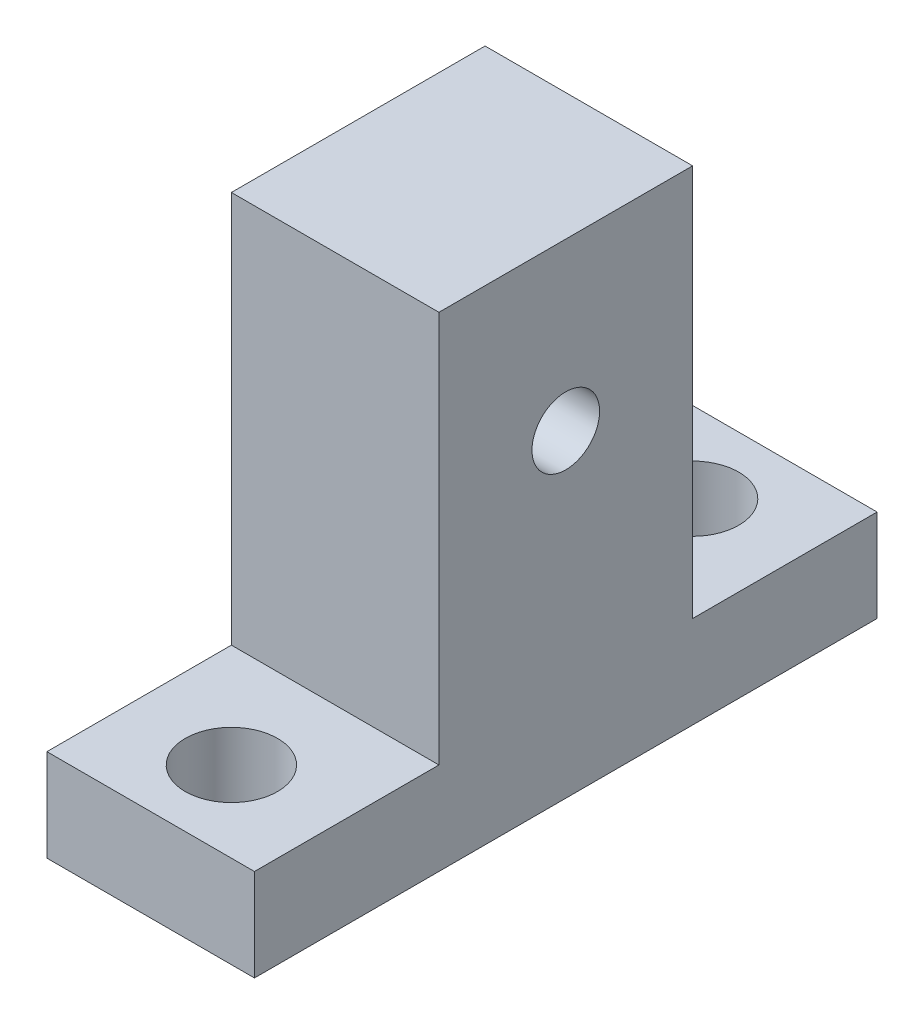
ISO-10303-21;
HEADER;
FILE_DESCRIPTION(('STEP AP214'),'2;1');
FILE_NAME('part.step','',(''),(''),'','','');
FILE_SCHEMA(('AUTOMOTIVE_DESIGN { 1 0 10303 214 1 1 1 1 }'));
ENDSEC;
DATA;
#1=APPLICATION_CONTEXT('core data for automotive mechanical design processes');
#2=APPLICATION_PROTOCOL_DEFINITION('international standard','automotive_design',2000,#1);
#3=PRODUCT_CONTEXT('',#1,'mechanical');
#4=PRODUCT('Part','Part','',(#3));
#5=PRODUCT_RELATED_PRODUCT_CATEGORY('part','',(#4));
#6=PRODUCT_DEFINITION_FORMATION('','',#4);
#7=PRODUCT_DEFINITION_CONTEXT('part definition',#1,'design');
#8=PRODUCT_DEFINITION('design','',#6,#7);
#9=PRODUCT_DEFINITION_SHAPE('','',#8);
#10=(LENGTH_UNIT() NAMED_UNIT(*) SI_UNIT(.MILLI.,.METRE.));
#11=(NAMED_UNIT(*) PLANE_ANGLE_UNIT() SI_UNIT($,.RADIAN.));
#12=(NAMED_UNIT(*) SI_UNIT($,.STERADIAN.) SOLID_ANGLE_UNIT());
#13=UNCERTAINTY_MEASURE_WITH_UNIT(LENGTH_MEASURE(1.E-05),#10,'distance_accuracy_value','');
#14=(GEOMETRIC_REPRESENTATION_CONTEXT(3) GLOBAL_UNCERTAINTY_ASSIGNED_CONTEXT((#13)) GLOBAL_UNIT_ASSIGNED_CONTEXT((#10,
#11,#12)) REPRESENTATION_CONTEXT('',''));
#15=CARTESIAN_POINT('',(0.,0.,0.));
#16=DIRECTION('',(0.,0.,1.));
#17=DIRECTION('',(1.,0.,0.));
#18=AXIS2_PLACEMENT_3D('',#15,#16,#17);
#19=CARTESIAN_POINT('',(14.2875,0.,0.));
#20=DIRECTION('',(1.,0.,0.));
#21=DIRECTION('',(0.,0.,-1.));
#22=AXIS2_PLACEMENT_3D('',#19,#20,#21);
#23=PLANE('',#22);
#24=DIRECTION('',(0.,-1.,0.));
#25=VECTOR('',#24,1.);
#26=CARTESIAN_POINT('',(14.2875,6.34999999999998,0.));
#27=LINE('',#26,#25);
#28=CARTESIAN_POINT('',(14.2875,6.34999999999998,0.));
#29=VERTEX_POINT('',#28);
#30=CARTESIAN_POINT('',(14.2875,0.,0.));
#31=VERTEX_POINT('',#30);
#32=EDGE_CURVE('E163',#29,#31,#27,.T.);
#33=ORIENTED_EDGE('',*,*,#32,.T.);
#34=DIRECTION('',(0.,0.,-1.));
#35=VECTOR('',#34,1.);
#36=CARTESIAN_POINT('',(14.2875,0.,0.));
#37=LINE('',#36,#35);
#38=CARTESIAN_POINT('',(14.2875,0.,-42.8625));
#39=VERTEX_POINT('',#38);
#40=EDGE_CURVE('E99',#31,#39,#37,.T.);
#41=ORIENTED_EDGE('',*,*,#40,.T.);
#42=DIRECTION('',(0.,1.,0.));
#43=VECTOR('',#42,1.);
#44=CARTESIAN_POINT('',(14.2875,0.,-42.8625));
#45=LINE('',#44,#43);
#46=CARTESIAN_POINT('',(14.2875,6.34999999999999,-42.8625));
#47=VERTEX_POINT('',#46);
#48=EDGE_CURVE('E184',#39,#47,#45,.T.);
#49=ORIENTED_EDGE('',*,*,#48,.T.);
#50=DIRECTION('',(0.,0.,1.));
#51=VECTOR('',#50,1.);
#52=CARTESIAN_POINT('',(14.2875,6.34999999999999,-42.8625));
#53=LINE('',#52,#51);
#54=CARTESIAN_POINT('',(14.2875,6.34999999999998,-30.1625));
#55=VERTEX_POINT('',#54);
#56=EDGE_CURVE('E198',#47,#55,#53,.T.);
#57=ORIENTED_EDGE('',*,*,#56,.T.);
#58=DIRECTION('',(0.,1.,0.));
#59=VECTOR('',#58,1.);
#60=CARTESIAN_POINT('',(14.2875,6.34999999999998,-30.1625));
#61=LINE('',#60,#59);
#62=CARTESIAN_POINT('',(14.2875,33.3375,-30.1625));
#63=VERTEX_POINT('',#62);
#64=EDGE_CURVE('E118',#55,#63,#61,.T.);
#65=ORIENTED_EDGE('',*,*,#64,.T.);
#66=DIRECTION('',(0.,0.,1.));
#67=VECTOR('',#66,1.);
#68=CARTESIAN_POINT('',(14.2875,33.3375,-30.1625));
#69=LINE('',#68,#67);
#70=CARTESIAN_POINT('',(14.2875,33.3375,-12.7));
#71=VERTEX_POINT('',#70);
#72=EDGE_CURVE('E112',#63,#71,#69,.T.);
#73=ORIENTED_EDGE('',*,*,#72,.T.);
#74=DIRECTION('',(0.,-1.,0.));
#75=VECTOR('',#74,1.);
#76=CARTESIAN_POINT('',(14.2875,33.3375,-12.7));
#77=LINE('',#76,#75);
#78=CARTESIAN_POINT('',(14.2875,6.34999999999999,-12.7));
#79=VERTEX_POINT('',#78);
#80=EDGE_CURVE('E116',#71,#79,#77,.T.);
#81=ORIENTED_EDGE('',*,*,#80,.T.);
#82=DIRECTION('',(0.,0.,1.));
#83=VECTOR('',#82,1.);
#84=CARTESIAN_POINT('',(14.2875,6.34999999999999,-12.7));
#85=LINE('',#84,#83);
#86=EDGE_CURVE('E56',#79,#29,#85,.T.);
#87=ORIENTED_EDGE('',*,*,#86,.T.);
#88=EDGE_LOOP('',(#33,#41,#49,#57,#65,#73,#81,#87));
#89=FACE_BOUND('',#88,.T.);
#90=CARTESIAN_POINT('',(14.2875,21.9075,-21.43125));
#91=DIRECTION('',(1.,0.,0.));
#92=DIRECTION('',(0.,0.,-1.));
#93=AXIS2_PLACEMENT_3D('',#90,#91,#92);
#94=CIRCLE('',#93,2.32833333333333);
#95=CARTESIAN_POINT('',(14.2875,21.9075,-23.7595833333333));
#96=VERTEX_POINT('',#95);
#97=EDGE_CURVE('E145',#96,#96,#94,.T.);
#98=ORIENTED_EDGE('',*,*,#97,.F.);
#99=EDGE_LOOP('',(#98));
#100=FACE_BOUND('',#99,.T.);
#101=ADVANCED_FACE('F38',(#89,#100),#23,.T.);
#102=CARTESIAN_POINT('',(0.,0.,0.));
#103=DIRECTION('',(1.,0.,0.));
#104=DIRECTION('',(0.,0.,-1.));
#105=AXIS2_PLACEMENT_3D('',#102,#103,#104);
#106=PLANE('',#105);
#107=DIRECTION('',(0.,-1.,0.));
#108=VECTOR('',#107,1.);
#109=CARTESIAN_POINT('',(0.,6.34999999999998,0.));
#110=LINE('',#109,#108);
#111=CARTESIAN_POINT('',(0.,6.34999999999998,0.));
#112=VERTEX_POINT('',#111);
#113=CARTESIAN_POINT('',(0.,0.,0.));
#114=VERTEX_POINT('',#113);
#115=EDGE_CURVE('E140',#112,#114,#110,.T.);
#116=ORIENTED_EDGE('',*,*,#115,.F.);
#117=DIRECTION('',(0.,0.,1.));
#118=VECTOR('',#117,1.);
#119=CARTESIAN_POINT('',(0.,6.34999999999999,-12.7));
#120=LINE('',#119,#118);
#121=CARTESIAN_POINT('',(0.,6.34999999999999,-12.7));
#122=VERTEX_POINT('',#121);
#123=EDGE_CURVE('E91',#122,#112,#120,.T.);
#124=ORIENTED_EDGE('',*,*,#123,.F.);
#125=DIRECTION('',(0.,-1.,0.));
#126=VECTOR('',#125,1.);
#127=CARTESIAN_POINT('',(0.,33.3375,-12.7));
#128=LINE('',#127,#126);
#129=CARTESIAN_POINT('',(0.,33.3375,-12.7));
#130=VERTEX_POINT('',#129);
#131=EDGE_CURVE('E85',#130,#122,#128,.T.);
#132=ORIENTED_EDGE('',*,*,#131,.F.);
#133=DIRECTION('',(0.,0.,1.));
#134=VECTOR('',#133,1.);
#135=CARTESIAN_POINT('',(0.,33.3375,-30.1625));
#136=LINE('',#135,#134);
#137=CARTESIAN_POINT('',(0.,33.3375,-30.1625));
#138=VERTEX_POINT('',#137);
#139=EDGE_CURVE('E127',#138,#130,#136,.T.);
#140=ORIENTED_EDGE('',*,*,#139,.F.);
#141=DIRECTION('',(0.,1.,0.));
#142=VECTOR('',#141,1.);
#143=CARTESIAN_POINT('',(0.,6.34999999999998,-30.1625));
#144=LINE('',#143,#142);
#145=CARTESIAN_POINT('',(0.,6.34999999999998,-30.1625));
#146=VERTEX_POINT('',#145);
#147=EDGE_CURVE('E154',#146,#138,#144,.T.);
#148=ORIENTED_EDGE('',*,*,#147,.F.);
#149=DIRECTION('',(0.,0.,1.));
#150=VECTOR('',#149,1.);
#151=CARTESIAN_POINT('',(0.,6.34999999999999,-42.8625));
#152=LINE('',#151,#150);
#153=CARTESIAN_POINT('',(0.,6.34999999999999,-42.8625));
#154=VERTEX_POINT('',#153);
#155=EDGE_CURVE('E151',#154,#146,#152,.T.);
#156=ORIENTED_EDGE('',*,*,#155,.F.);
#157=DIRECTION('',(0.,1.,0.));
#158=VECTOR('',#157,1.);
#159=CARTESIAN_POINT('',(0.,0.,-42.8625));
#160=LINE('',#159,#158);
#161=CARTESIAN_POINT('',(0.,0.,-42.8625));
#162=VERTEX_POINT('',#161);
#163=EDGE_CURVE('E148',#162,#154,#160,.T.);
#164=ORIENTED_EDGE('',*,*,#163,.F.);
#165=DIRECTION('',(0.,0.,-1.));
#166=VECTOR('',#165,1.);
#167=CARTESIAN_POINT('',(0.,0.,0.));
#168=LINE('',#167,#166);
#169=EDGE_CURVE('E144',#114,#162,#168,.T.);
#170=ORIENTED_EDGE('',*,*,#169,.F.);
#171=EDGE_LOOP('',(#116,#124,#132,#140,#148,#156,#164,#170));
#172=FACE_BOUND('',#171,.T.);
#173=CARTESIAN_POINT('',(0.,21.9075,-21.43125));
#174=DIRECTION('',(1.,0.,0.));
#175=DIRECTION('',(0.,0.,-1.));
#176=AXIS2_PLACEMENT_3D('',#173,#174,#175);
#177=CIRCLE('',#176,2.32833333333333);
#178=CARTESIAN_POINT('',(0.,21.9075,-23.7595833333333));
#179=VERTEX_POINT('',#178);
#180=EDGE_CURVE('E208',#179,#179,#177,.T.);
#181=ORIENTED_EDGE('',*,*,#180,.T.);
#182=EDGE_LOOP('',(#181));
#183=FACE_BOUND('',#182,.T.);
#184=ADVANCED_FACE('F188',(#172,#183),#106,.F.);
#185=CARTESIAN_POINT('',(14.2875,6.34999999999998,0.));
#186=DIRECTION('',(0.,0.,-1.));
#187=DIRECTION('',(0.,1.,0.));
#188=AXIS2_PLACEMENT_3D('',#185,#186,#187);
#189=PLANE('',#188);
#190=ORIENTED_EDGE('',*,*,#115,.T.);
#191=DIRECTION('',(-1.,0.,0.));
#192=VECTOR('',#191,1.);
#193=CARTESIAN_POINT('',(14.2875,0.,0.));
#194=LINE('',#193,#192);
#195=EDGE_CURVE('E11',#31,#114,#194,.T.);
#196=ORIENTED_EDGE('',*,*,#195,.F.);
#197=ORIENTED_EDGE('',*,*,#32,.F.);
#198=DIRECTION('',(-1.,0.,0.));
#199=VECTOR('',#198,1.);
#200=CARTESIAN_POINT('',(14.2875,6.34999999999998,0.));
#201=LINE('',#200,#199);
#202=EDGE_CURVE('E136',#29,#112,#201,.T.);
#203=ORIENTED_EDGE('',*,*,#202,.T.);
#204=EDGE_LOOP('',(#190,#196,#197,#203));
#205=FACE_BOUND('',#204,.T.);
#206=ADVANCED_FACE('F40',(#205),#189,.F.);
#207=CARTESIAN_POINT('',(14.2875,0.,0.));
#208=DIRECTION('',(0.,1.,0.));
#209=DIRECTION('',(0.,0.,1.));
#210=AXIS2_PLACEMENT_3D('',#207,#208,#209);
#211=PLANE('',#210);
#212=CARTESIAN_POINT('',(7.14375,0.,-5.55625));
#213=DIRECTION('',(0.,1.,0.));
#214=DIRECTION('',(0.,0.,1.));
#215=AXIS2_PLACEMENT_3D('',#212,#213,#214);
#216=CIRCLE('',#215,3.175);
#217=CARTESIAN_POINT('',(7.14375,0.,-2.38124999999999));
#218=VERTEX_POINT('',#217);
#219=EDGE_CURVE('E219',#218,#218,#216,.T.);
#220=ORIENTED_EDGE('',*,*,#219,.T.);
#221=EDGE_LOOP('',(#220));
#222=FACE_BOUND('',#221,.T.);
#223=CARTESIAN_POINT('',(7.14375,0.,-37.30625));
#224=DIRECTION('',(0.,1.,0.));
#225=DIRECTION('',(0.,0.,1.));
#226=AXIS2_PLACEMENT_3D('',#223,#224,#225);
#227=CIRCLE('',#226,3.175);
#228=CARTESIAN_POINT('',(7.14375,0.,-34.13125));
#229=VERTEX_POINT('',#228);
#230=EDGE_CURVE('E212',#229,#229,#227,.T.);
#231=ORIENTED_EDGE('',*,*,#230,.T.);
#232=EDGE_LOOP('',(#231));
#233=FACE_BOUND('',#232,.T.);
#234=ORIENTED_EDGE('',*,*,#169,.T.);
#235=DIRECTION('',(-1.,0.,0.));
#236=VECTOR('',#235,1.);
#237=CARTESIAN_POINT('',(14.2875,0.,-42.8625));
#238=LINE('',#237,#236);
#239=EDGE_CURVE('E48',#39,#162,#238,.T.);
#240=ORIENTED_EDGE('',*,*,#239,.F.);
#241=ORIENTED_EDGE('',*,*,#40,.F.);
#242=ORIENTED_EDGE('',*,*,#195,.T.);
#243=EDGE_LOOP('',(#234,#240,#241,#242));
#244=FACE_BOUND('',#243,.T.);
#245=ADVANCED_FACE('F314',(#222,#233,#244),#211,.F.);
#246=CARTESIAN_POINT('',(14.2875,0.,-42.8625));
#247=DIRECTION('',(0.,0.,1.));
#248=DIRECTION('',(1.,0.,0.));
#249=AXIS2_PLACEMENT_3D('',#246,#247,#248);
#250=PLANE('',#249);
#251=ORIENTED_EDGE('',*,*,#163,.T.);
#252=DIRECTION('',(-1.,0.,0.));
#253=VECTOR('',#252,1.);
#254=CARTESIAN_POINT('',(14.2875,6.34999999999999,-42.8625));
#255=LINE('',#254,#253);
#256=EDGE_CURVE('E174',#47,#154,#255,.T.);
#257=ORIENTED_EDGE('',*,*,#256,.F.);
#258=ORIENTED_EDGE('',*,*,#48,.F.);
#259=ORIENTED_EDGE('',*,*,#239,.T.);
#260=EDGE_LOOP('',(#251,#257,#258,#259));
#261=FACE_BOUND('',#260,.T.);
#262=ADVANCED_FACE('F182',(#261),#250,.F.);
#263=CARTESIAN_POINT('',(14.2875,6.34999999999999,-42.8625));
#264=DIRECTION('',(0.,-1.,0.));
#265=DIRECTION('',(0.,0.,-1.));
#266=AXIS2_PLACEMENT_3D('',#263,#264,#265);
#267=PLANE('',#266);
#268=CARTESIAN_POINT('',(7.14375,6.34999999999999,-37.30625));
#269=DIRECTION('',(0.,1.,0.));
#270=DIRECTION('',(0.,0.,1.));
#271=AXIS2_PLACEMENT_3D('',#268,#269,#270);
#272=CIRCLE('',#271,3.175);
#273=CARTESIAN_POINT('',(7.14375,6.34999999999999,-34.13125));
#274=VERTEX_POINT('',#273);
#275=EDGE_CURVE('E224',#274,#274,#272,.T.);
#276=ORIENTED_EDGE('',*,*,#275,.F.);
#277=EDGE_LOOP('',(#276));
#278=FACE_BOUND('',#277,.T.);
#279=ORIENTED_EDGE('',*,*,#155,.T.);
#280=DIRECTION('',(-1.,0.,0.));
#281=VECTOR('',#280,1.);
#282=CARTESIAN_POINT('',(14.2875,6.34999999999998,-30.1625));
#283=LINE('',#282,#281);
#284=EDGE_CURVE('E170',#55,#146,#283,.T.);
#285=ORIENTED_EDGE('',*,*,#284,.F.);
#286=ORIENTED_EDGE('',*,*,#56,.F.);
#287=ORIENTED_EDGE('',*,*,#256,.T.);
#288=EDGE_LOOP('',(#279,#285,#286,#287));
#289=FACE_BOUND('',#288,.T.);
#290=ADVANCED_FACE('F193',(#278,#289),#267,.F.);
#291=CARTESIAN_POINT('',(14.2875,6.34999999999998,-30.1625));
#292=DIRECTION('',(0.,0.,1.));
#293=DIRECTION('',(0.,-1.,0.));
#294=AXIS2_PLACEMENT_3D('',#291,#292,#293);
#295=PLANE('',#294);
#296=ORIENTED_EDGE('',*,*,#147,.T.);
#297=DIRECTION('',(-1.,0.,0.));
#298=VECTOR('',#297,1.);
#299=CARTESIAN_POINT('',(14.2875,33.3375,-30.1625));
#300=LINE('',#299,#298);
#301=EDGE_CURVE('E129',#63,#138,#300,.T.);
#302=ORIENTED_EDGE('',*,*,#301,.F.);
#303=ORIENTED_EDGE('',*,*,#64,.F.);
#304=ORIENTED_EDGE('',*,*,#284,.T.);
#305=EDGE_LOOP('',(#296,#302,#303,#304));
#306=FACE_BOUND('',#305,.T.);
#307=ADVANCED_FACE('F196',(#306),#295,.F.);
#308=CARTESIAN_POINT('',(14.2875,33.3375,-30.1625));
#309=DIRECTION('',(0.,-1.,0.));
#310=DIRECTION('',(0.,0.,-1.));
#311=AXIS2_PLACEMENT_3D('',#308,#309,#310);
#312=PLANE('',#311);
#313=ORIENTED_EDGE('',*,*,#139,.T.);
#314=DIRECTION('',(-1.,0.,0.));
#315=VECTOR('',#314,1.);
#316=CARTESIAN_POINT('',(14.2875,33.3375,-12.7));
#317=LINE('',#316,#315);
#318=EDGE_CURVE('E124',#71,#130,#317,.T.);
#319=ORIENTED_EDGE('',*,*,#318,.F.);
#320=ORIENTED_EDGE('',*,*,#72,.F.);
#321=ORIENTED_EDGE('',*,*,#301,.T.);
#322=EDGE_LOOP('',(#313,#319,#320,#321));
#323=FACE_BOUND('',#322,.T.);
#324=ADVANCED_FACE('F125',(#323),#312,.F.);
#325=CARTESIAN_POINT('',(14.2875,33.3375,-12.7));
#326=DIRECTION('',(0.,0.,-1.));
#327=DIRECTION('',(0.,1.,0.));
#328=AXIS2_PLACEMENT_3D('',#325,#326,#327);
#329=PLANE('',#328);
#330=ORIENTED_EDGE('',*,*,#131,.T.);
#331=DIRECTION('',(-1.,0.,0.));
#332=VECTOR('',#331,1.);
#333=CARTESIAN_POINT('',(14.2875,6.34999999999999,-12.7));
#334=LINE('',#333,#332);
#335=EDGE_CURVE('E130',#79,#122,#334,.T.);
#336=ORIENTED_EDGE('',*,*,#335,.F.);
#337=ORIENTED_EDGE('',*,*,#80,.F.);
#338=ORIENTED_EDGE('',*,*,#318,.T.);
#339=EDGE_LOOP('',(#330,#336,#337,#338));
#340=FACE_BOUND('',#339,.T.);
#341=ADVANCED_FACE('F132',(#340),#329,.F.);
#342=CARTESIAN_POINT('',(14.2875,6.34999999999999,-12.7));
#343=DIRECTION('',(0.,-1.,0.));
#344=DIRECTION('',(0.,0.,-1.));
#345=AXIS2_PLACEMENT_3D('',#342,#343,#344);
#346=PLANE('',#345);
#347=CARTESIAN_POINT('',(7.14375,6.34999999999999,-5.55624999999999));
#348=DIRECTION('',(0.,1.,0.));
#349=DIRECTION('',(0.,0.,1.));
#350=AXIS2_PLACEMENT_3D('',#347,#348,#349);
#351=CIRCLE('',#350,3.175);
#352=CARTESIAN_POINT('',(7.14375,6.34999999999998,-2.38124999999999));
#353=VERTEX_POINT('',#352);
#354=EDGE_CURVE('E223',#353,#353,#351,.T.);
#355=ORIENTED_EDGE('',*,*,#354,.F.);
#356=EDGE_LOOP('',(#355));
#357=FACE_BOUND('',#356,.T.);
#358=ORIENTED_EDGE('',*,*,#123,.T.);
#359=ORIENTED_EDGE('',*,*,#202,.F.);
#360=ORIENTED_EDGE('',*,*,#86,.F.);
#361=ORIENTED_EDGE('',*,*,#335,.T.);
#362=EDGE_LOOP('',(#358,#359,#360,#361));
#363=FACE_BOUND('',#362,.T.);
#364=ADVANCED_FACE('F235',(#357,#363),#346,.F.);
#365=CARTESIAN_POINT('',(14.2875,21.9075,-21.43125));
#366=DIRECTION('',(-1.,0.,0.));
#367=DIRECTION('',(0.,0.,1.));
#368=AXIS2_PLACEMENT_3D('',#365,#366,#367);
#369=CYLINDRICAL_SURFACE('',#368,2.32833333333333);
#370=ORIENTED_EDGE('',*,*,#97,.T.);
#371=EDGE_LOOP('',(#370));
#372=FACE_BOUND('',#371,.T.);
#373=ORIENTED_EDGE('',*,*,#180,.F.);
#374=EDGE_LOOP('',(#373));
#375=FACE_BOUND('',#374,.T.);
#376=ADVANCED_FACE('F237',(#372,#375),#369,.F.);
#377=CARTESIAN_POINT('',(7.14375,-7.93750000000001,-5.55625));
#378=DIRECTION('',(0.,1.,0.));
#379=DIRECTION('',(0.,0.,1.));
#380=AXIS2_PLACEMENT_3D('',#377,#378,#379);
#381=CYLINDRICAL_SURFACE('',#380,3.175);
#382=ORIENTED_EDGE('',*,*,#354,.T.);
#383=EDGE_LOOP('',(#382));
#384=FACE_BOUND('',#383,.T.);
#385=ORIENTED_EDGE('',*,*,#219,.F.);
#386=EDGE_LOOP('',(#385));
#387=FACE_BOUND('',#386,.T.);
#388=ADVANCED_FACE('F232',(#384,#387),#381,.F.);
#389=CARTESIAN_POINT('',(7.14375,-7.93750000000001,-37.30625));
#390=DIRECTION('',(0.,1.,0.));
#391=DIRECTION('',(0.,0.,1.));
#392=AXIS2_PLACEMENT_3D('',#389,#390,#391);
#393=CYLINDRICAL_SURFACE('',#392,3.175);
#394=ORIENTED_EDGE('',*,*,#275,.T.);
#395=EDGE_LOOP('',(#394));
#396=FACE_BOUND('',#395,.T.);
#397=ORIENTED_EDGE('',*,*,#230,.F.);
#398=EDGE_LOOP('',(#397));
#399=FACE_BOUND('',#398,.T.);
#400=ADVANCED_FACE('F255',(#396,#399),#393,.F.);
#401=CLOSED_SHELL('',(#101,#184,#206,#245,#262,#290,#307,#324,#341,#364,#376,#388,#400));
#402=MANIFOLD_SOLID_BREP('B2',#401);
#403=ADVANCED_BREP_SHAPE_REPRESENTATION('',(#18,#402),#14);
#404=SHAPE_DEFINITION_REPRESENTATION(#9,#403);
ENDSEC;
END-ISO-10303-21;
